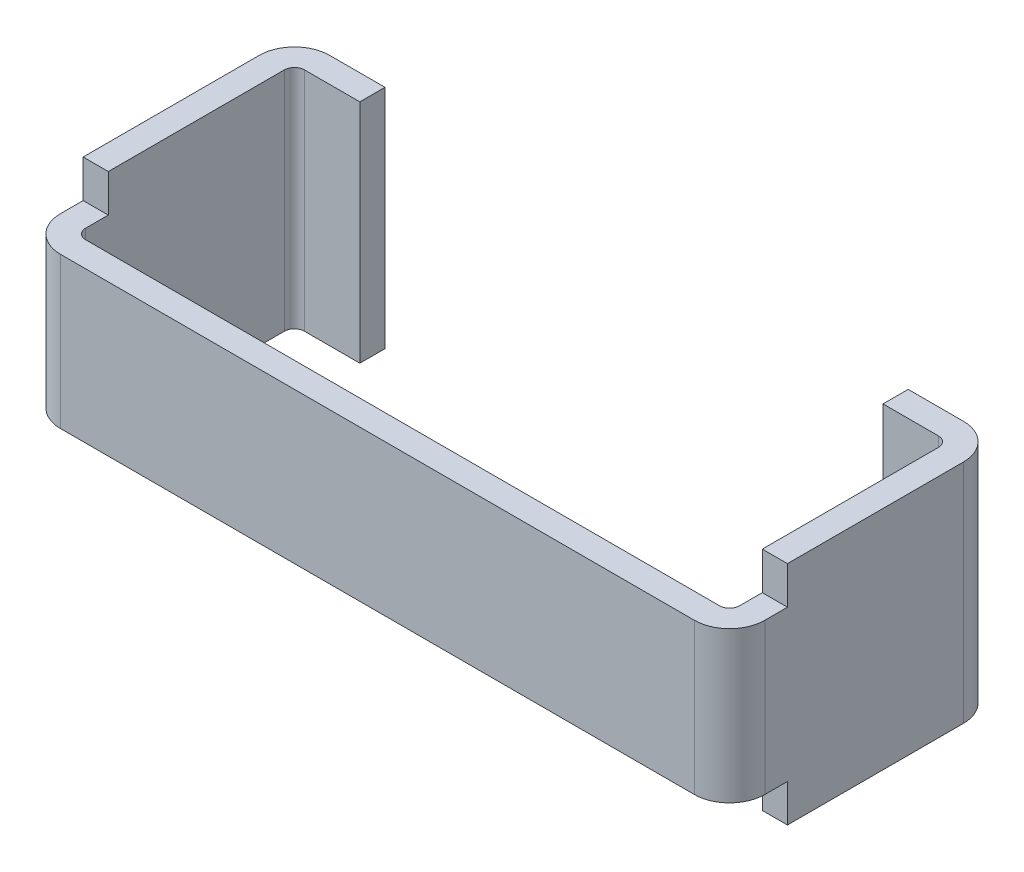
ISO-10303-21;
HEADER;
FILE_DESCRIPTION(('STEP AP214'),'2;1');
FILE_NAME('part.step','',(''),(''),'','','');
FILE_SCHEMA(('AUTOMOTIVE_DESIGN { 1 0 10303 214 1 1 1 1 }'));
ENDSEC;
DATA;
#1=APPLICATION_CONTEXT('core data for automotive mechanical design processes');
#2=APPLICATION_PROTOCOL_DEFINITION('international standard','automotive_design',2000,#1);
#3=PRODUCT_CONTEXT('',#1,'mechanical');
#4=PRODUCT('Part','Part','',(#3));
#5=PRODUCT_RELATED_PRODUCT_CATEGORY('part','',(#4));
#6=PRODUCT_DEFINITION_FORMATION('','',#4);
#7=PRODUCT_DEFINITION_CONTEXT('part definition',#1,'design');
#8=PRODUCT_DEFINITION('design','',#6,#7);
#9=PRODUCT_DEFINITION_SHAPE('','',#8);
#10=(LENGTH_UNIT() NAMED_UNIT(*) SI_UNIT(.MILLI.,.METRE.));
#11=(NAMED_UNIT(*) PLANE_ANGLE_UNIT() SI_UNIT($,.RADIAN.));
#12=(NAMED_UNIT(*) SI_UNIT($,.STERADIAN.) SOLID_ANGLE_UNIT());
#13=UNCERTAINTY_MEASURE_WITH_UNIT(LENGTH_MEASURE(1.E-05),#10,'distance_accuracy_value','');
#14=(GEOMETRIC_REPRESENTATION_CONTEXT(3) GLOBAL_UNCERTAINTY_ASSIGNED_CONTEXT((#13)) GLOBAL_UNIT_ASSIGNED_CONTEXT((#10,
#11,#12)) REPRESENTATION_CONTEXT('',''));
#15=CARTESIAN_POINT('',(0.,0.,0.));
#16=DIRECTION('',(0.,0.,1.));
#17=DIRECTION('',(1.,0.,0.));
#18=AXIS2_PLACEMENT_3D('',#15,#16,#17);
#19=CARTESIAN_POINT('',(6.3,-1.5,-4.65));
#20=DIRECTION('',(0.,-1.,0.));
#21=DIRECTION('',(0.,0.,-1.));
#22=AXIS2_PLACEMENT_3D('',#19,#20,#21);
#23=PLANE('',#22);
#24=DIRECTION('',(-1.,0.,0.));
#25=VECTOR('',#24,1.);
#26=CARTESIAN_POINT('',(6.3,-1.5,-1.15));
#27=LINE('',#26,#25);
#28=CARTESIAN_POINT('',(-6.5,-1.5,-1.15));
#29=VERTEX_POINT('',#28);
#30=CARTESIAN_POINT('',(-7.,-1.5,-1.15));
#31=VERTEX_POINT('',#30);
#32=EDGE_CURVE('E11',#29,#31,#27,.T.);
#33=ORIENTED_EDGE('',*,*,#32,.F.);
#34=DIRECTION('',(0.,0.,-1.));
#35=VECTOR('',#34,1.);
#36=CARTESIAN_POINT('',(-6.5,-1.5,-0.7));
#37=LINE('',#36,#35);
#38=CARTESIAN_POINT('',(-6.5,-1.5,-0.7));
#39=VERTEX_POINT('',#38);
#40=EDGE_CURVE('E24',#39,#29,#37,.T.);
#41=ORIENTED_EDGE('',*,*,#40,.F.);
#42=CARTESIAN_POINT('',(-6.3,-1.5,-0.7));
#43=DIRECTION('',(0.,-1.,0.));
#44=DIRECTION('',(1.,0.,0.));
#45=AXIS2_PLACEMENT_3D('',#42,#43,#44);
#46=CIRCLE('',#45,0.2);
#47=CARTESIAN_POINT('',(-6.3,-1.5,-0.5));
#48=VERTEX_POINT('',#47);
#49=EDGE_CURVE('E425',#48,#39,#46,.T.);
#50=ORIENTED_EDGE('',*,*,#49,.F.);
#51=DIRECTION('',(-1.,0.,0.));
#52=VECTOR('',#51,1.);
#53=CARTESIAN_POINT('',(6.3,-1.5,-0.5));
#54=LINE('',#53,#52);
#55=CARTESIAN_POINT('',(6.3,-1.5,-0.5));
#56=VERTEX_POINT('',#55);
#57=EDGE_CURVE('E422',#56,#48,#54,.T.);
#58=ORIENTED_EDGE('',*,*,#57,.F.);
#59=CARTESIAN_POINT('',(6.3,-1.5,-0.7));
#60=DIRECTION('',(0.,-1.,0.));
#61=DIRECTION('',(1.,0.,0.));
#62=AXIS2_PLACEMENT_3D('',#59,#60,#61);
#63=CIRCLE('',#62,0.2);
#64=CARTESIAN_POINT('',(6.5,-1.5,-0.7));
#65=VERTEX_POINT('',#64);
#66=EDGE_CURVE('E419',#65,#56,#63,.T.);
#67=ORIENTED_EDGE('',*,*,#66,.F.);
#68=DIRECTION('',(0.,0.,1.));
#69=VECTOR('',#68,1.);
#70=CARTESIAN_POINT('',(6.5,-1.5,-4.65));
#71=LINE('',#70,#69);
#72=CARTESIAN_POINT('',(6.5,-1.5,-1.15));
#73=VERTEX_POINT('',#72);
#74=EDGE_CURVE('E416',#73,#65,#71,.T.);
#75=ORIENTED_EDGE('',*,*,#74,.F.);
#76=DIRECTION('',(1.,0.,0.));
#77=VECTOR('',#76,1.);
#78=CARTESIAN_POINT('',(6.3,-1.5,-1.15));
#79=LINE('',#78,#77);
#80=CARTESIAN_POINT('',(7.,-1.5,-1.15));
#81=VERTEX_POINT('',#80);
#82=EDGE_CURVE('E414',#73,#81,#79,.T.);
#83=ORIENTED_EDGE('',*,*,#82,.T.);
#84=DIRECTION('',(0.,0.,-1.));
#85=VECTOR('',#84,1.);
#86=CARTESIAN_POINT('',(7.,-1.5,-4.65));
#87=LINE('',#86,#85);
#88=CARTESIAN_POINT('',(7.,-1.5,-0.7));
#89=VERTEX_POINT('',#88);
#90=EDGE_CURVE('E411',#89,#81,#87,.T.);
#91=ORIENTED_EDGE('',*,*,#90,.F.);
#92=CARTESIAN_POINT('',(6.3,-1.5,-0.7));
#93=DIRECTION('',(0.,1.,0.));
#94=DIRECTION('',(-1.,0.,0.));
#95=AXIS2_PLACEMENT_3D('',#92,#93,#94);
#96=CIRCLE('',#95,0.7);
#97=CARTESIAN_POINT('',(6.3,-1.5,0.));
#98=VERTEX_POINT('',#97);
#99=EDGE_CURVE('E408',#98,#89,#96,.T.);
#100=ORIENTED_EDGE('',*,*,#99,.F.);
#101=DIRECTION('',(1.,0.,0.));
#102=VECTOR('',#101,1.);
#103=CARTESIAN_POINT('',(6.3,-1.5,0.));
#104=LINE('',#103,#102);
#105=CARTESIAN_POINT('',(-6.3,-1.5,0.));
#106=VERTEX_POINT('',#105);
#107=EDGE_CURVE('E405',#106,#98,#104,.T.);
#108=ORIENTED_EDGE('',*,*,#107,.F.);
#109=CARTESIAN_POINT('',(-6.3,-1.5,-0.7));
#110=DIRECTION('',(0.,1.,0.));
#111=DIRECTION('',(1.,0.,0.));
#112=AXIS2_PLACEMENT_3D('',#109,#110,#111);
#113=CIRCLE('',#112,0.7);
#114=CARTESIAN_POINT('',(-7.,-1.5,-0.7));
#115=VERTEX_POINT('',#114);
#116=EDGE_CURVE('E402',#115,#106,#113,.T.);
#117=ORIENTED_EDGE('',*,*,#116,.F.);
#118=DIRECTION('',(0.,0.,1.));
#119=VECTOR('',#118,1.);
#120=CARTESIAN_POINT('',(-7.,-1.5,-0.7));
#121=LINE('',#120,#119);
#122=EDGE_CURVE('E399',#31,#115,#121,.T.);
#123=ORIENTED_EDGE('',*,*,#122,.F.);
#124=EDGE_LOOP('',(#33,#41,#50,#58,#67,#75,#83,#91,#100,#108,#117,#123));
#125=FACE_BOUND('',#124,.T.);
#126=ADVANCED_FACE('F17',(#125),#23,.T.);
#127=CARTESIAN_POINT('',(5.2,-1.5,-4.85));
#128=DIRECTION('',(-1.,0.,0.));
#129=DIRECTION('',(0.,0.,1.));
#130=AXIS2_PLACEMENT_3D('',#127,#128,#129);
#131=PLANE('',#130);
#132=DIRECTION('',(0.,1.,0.));
#133=VECTOR('',#132,1.);
#134=CARTESIAN_POINT('',(5.2,-1.5,-4.85));
#135=LINE('',#134,#133);
#136=CARTESIAN_POINT('',(5.2,-2.25,-4.85));
#137=VERTEX_POINT('',#136);
#138=CARTESIAN_POINT('',(5.2,2.25,-4.85));
#139=VERTEX_POINT('',#138);
#140=EDGE_CURVE('E397',#137,#139,#135,.T.);
#141=ORIENTED_EDGE('',*,*,#140,.T.);
#142=DIRECTION('',(0.,0.,-1.));
#143=VECTOR('',#142,1.);
#144=CARTESIAN_POINT('',(5.2,2.25,-4.85));
#145=LINE('',#144,#143);
#146=CARTESIAN_POINT('',(5.2,2.25,-5.35));
#147=VERTEX_POINT('',#146);
#148=EDGE_CURVE('E395',#139,#147,#145,.T.);
#149=ORIENTED_EDGE('',*,*,#148,.T.);
#150=DIRECTION('',(0.,1.,0.));
#151=VECTOR('',#150,1.);
#152=CARTESIAN_POINT('',(5.2,-1.5,-5.35));
#153=LINE('',#152,#151);
#154=CARTESIAN_POINT('',(5.2,-2.25,-5.35));
#155=VERTEX_POINT('',#154);
#156=EDGE_CURVE('E392',#155,#147,#153,.T.);
#157=ORIENTED_EDGE('',*,*,#156,.F.);
#158=DIRECTION('',(0.,0.,-1.));
#159=VECTOR('',#158,1.);
#160=CARTESIAN_POINT('',(5.2,-2.25,-4.85));
#161=LINE('',#160,#159);
#162=EDGE_CURVE('E389',#137,#155,#161,.T.);
#163=ORIENTED_EDGE('',*,*,#162,.F.);
#164=EDGE_LOOP('',(#141,#149,#157,#163));
#165=FACE_BOUND('',#164,.T.);
#166=ADVANCED_FACE('F517',(#165),#131,.T.);
#167=CARTESIAN_POINT('',(-6.3,-1.5,-5.35));
#168=DIRECTION('',(0.,0.,-1.));
#169=DIRECTION('',(-1.,0.,0.));
#170=AXIS2_PLACEMENT_3D('',#167,#168,#169);
#171=PLANE('',#170);
#172=DIRECTION('',(0.,1.,0.));
#173=VECTOR('',#172,1.);
#174=CARTESIAN_POINT('',(-6.3,-1.5,-5.35));
#175=LINE('',#174,#173);
#176=CARTESIAN_POINT('',(-6.3,-2.25,-5.35));
#177=VERTEX_POINT('',#176);
#178=CARTESIAN_POINT('',(-6.3,2.25,-5.35));
#179=VERTEX_POINT('',#178);
#180=EDGE_CURVE('E387',#177,#179,#175,.T.);
#181=ORIENTED_EDGE('',*,*,#180,.T.);
#182=DIRECTION('',(-1.,0.,0.));
#183=VECTOR('',#182,1.);
#184=CARTESIAN_POINT('',(-5.2,2.25,-5.35));
#185=LINE('',#184,#183);
#186=CARTESIAN_POINT('',(-5.2,2.25,-5.35));
#187=VERTEX_POINT('',#186);
#188=EDGE_CURVE('E384',#187,#179,#185,.T.);
#189=ORIENTED_EDGE('',*,*,#188,.F.);
#190=DIRECTION('',(0.,1.,0.));
#191=VECTOR('',#190,1.);
#192=CARTESIAN_POINT('',(-5.2,-1.5,-5.35));
#193=LINE('',#192,#191);
#194=CARTESIAN_POINT('',(-5.2,-2.25,-5.35));
#195=VERTEX_POINT('',#194);
#196=EDGE_CURVE('E381',#195,#187,#193,.T.);
#197=ORIENTED_EDGE('',*,*,#196,.F.);
#198=DIRECTION('',(-1.,0.,0.));
#199=VECTOR('',#198,1.);
#200=CARTESIAN_POINT('',(-5.2,-2.25,-5.35));
#201=LINE('',#200,#199);
#202=EDGE_CURVE('E378',#195,#177,#201,.T.);
#203=ORIENTED_EDGE('',*,*,#202,.T.);
#204=EDGE_LOOP('',(#181,#189,#197,#203));
#205=FACE_BOUND('',#204,.T.);
#206=ADVANCED_FACE('F535',(#205),#171,.T.);
#207=CARTESIAN_POINT('',(-6.3,-2.25,-4.65));
#208=DIRECTION('',(0.,1.,0.));
#209=DIRECTION('',(0.,0.,1.));
#210=AXIS2_PLACEMENT_3D('',#207,#208,#209);
#211=PLANE('',#210);
#212=DIRECTION('',(0.,0.,-1.));
#213=VECTOR('',#212,1.);
#214=CARTESIAN_POINT('',(-5.2,-2.25,-4.85));
#215=LINE('',#214,#213);
#216=CARTESIAN_POINT('',(-5.2,-2.25,-4.85));
#217=VERTEX_POINT('',#216);
#218=EDGE_CURVE('E375',#217,#195,#215,.T.);
#219=ORIENTED_EDGE('',*,*,#218,.F.);
#220=DIRECTION('',(1.,0.,0.));
#221=VECTOR('',#220,1.);
#222=CARTESIAN_POINT('',(-5.2,-2.25,-4.85));
#223=LINE('',#222,#221);
#224=CARTESIAN_POINT('',(-6.3,-2.25,-4.85));
#225=VERTEX_POINT('',#224);
#226=EDGE_CURVE('E373',#225,#217,#223,.T.);
#227=ORIENTED_EDGE('',*,*,#226,.F.);
#228=CARTESIAN_POINT('',(-6.3,-2.25,-4.65));
#229=DIRECTION('',(0.,-1.,0.));
#230=DIRECTION('',(1.,0.,0.));
#231=AXIS2_PLACEMENT_3D('',#228,#229,#230);
#232=CIRCLE('',#231,0.2);
#233=CARTESIAN_POINT('',(-6.5,-2.25,-4.65));
#234=VERTEX_POINT('',#233);
#235=EDGE_CURVE('E216',#234,#225,#232,.T.);
#236=ORIENTED_EDGE('',*,*,#235,.F.);
#237=DIRECTION('',(0.,0.,-1.));
#238=VECTOR('',#237,1.);
#239=CARTESIAN_POINT('',(-6.5,-2.25,-4.65));
#240=LINE('',#239,#238);
#241=CARTESIAN_POINT('',(-6.5,-2.25,-1.15));
#242=VERTEX_POINT('',#241);
#243=EDGE_CURVE('E370',#242,#234,#240,.T.);
#244=ORIENTED_EDGE('',*,*,#243,.F.);
#245=DIRECTION('',(1.,0.,0.));
#246=VECTOR('',#245,1.);
#247=CARTESIAN_POINT('',(-6.5,-2.25,-1.15));
#248=LINE('',#247,#246);
#249=CARTESIAN_POINT('',(-7.,-2.25,-1.15));
#250=VERTEX_POINT('',#249);
#251=EDGE_CURVE('E368',#250,#242,#248,.T.);
#252=ORIENTED_EDGE('',*,*,#251,.F.);
#253=DIRECTION('',(0.,0.,1.));
#254=VECTOR('',#253,1.);
#255=CARTESIAN_POINT('',(-7.,-2.25,-4.65));
#256=LINE('',#255,#254);
#257=CARTESIAN_POINT('',(-7.,-2.25,-4.65));
#258=VERTEX_POINT('',#257);
#259=EDGE_CURVE('E366',#258,#250,#256,.T.);
#260=ORIENTED_EDGE('',*,*,#259,.F.);
#261=CARTESIAN_POINT('',(-6.3,-2.25,-4.65));
#262=DIRECTION('',(0.,1.,0.));
#263=DIRECTION('',(1.,0.,0.));
#264=AXIS2_PLACEMENT_3D('',#261,#262,#263);
#265=CIRCLE('',#264,0.7);
#266=EDGE_CURVE('E364',#177,#258,#265,.T.);
#267=ORIENTED_EDGE('',*,*,#266,.F.);
#268=ORIENTED_EDGE('',*,*,#202,.F.);
#269=EDGE_LOOP('',(#219,#227,#236,#244,#252,#260,#267,#268));
#270=FACE_BOUND('',#269,.T.);
#271=ADVANCED_FACE('F438',(#270),#211,.F.);
#272=CARTESIAN_POINT('',(-5.2,-1.5,-4.85));
#273=DIRECTION('',(1.,0.,0.));
#274=DIRECTION('',(0.,0.,-1.));
#275=AXIS2_PLACEMENT_3D('',#272,#273,#274);
#276=PLANE('',#275);
#277=ORIENTED_EDGE('',*,*,#196,.T.);
#278=DIRECTION('',(0.,0.,-1.));
#279=VECTOR('',#278,1.);
#280=CARTESIAN_POINT('',(-5.2,2.25,-4.85));
#281=LINE('',#280,#279);
#282=CARTESIAN_POINT('',(-5.2,2.25,-4.85));
#283=VERTEX_POINT('',#282);
#284=EDGE_CURVE('E362',#283,#187,#281,.T.);
#285=ORIENTED_EDGE('',*,*,#284,.F.);
#286=DIRECTION('',(0.,1.,0.));
#287=VECTOR('',#286,1.);
#288=CARTESIAN_POINT('',(-5.2,-1.5,-4.85));
#289=LINE('',#288,#287);
#290=EDGE_CURVE('E204',#217,#283,#289,.T.);
#291=ORIENTED_EDGE('',*,*,#290,.F.);
#292=ORIENTED_EDGE('',*,*,#218,.T.);
#293=EDGE_LOOP('',(#277,#285,#291,#292));
#294=FACE_BOUND('',#293,.T.);
#295=ADVANCED_FACE('F521',(#294),#276,.T.);
#296=CARTESIAN_POINT('',(5.2,-1.5,-4.85));
#297=DIRECTION('',(0.,0.,1.));
#298=DIRECTION('',(1.,0.,0.));
#299=AXIS2_PLACEMENT_3D('',#296,#297,#298);
#300=PLANE('',#299);
#301=DIRECTION('',(0.,1.,0.));
#302=VECTOR('',#301,1.);
#303=CARTESIAN_POINT('',(6.3,-1.5,-4.85));
#304=LINE('',#303,#302);
#305=CARTESIAN_POINT('',(6.3,-2.25,-4.85));
#306=VERTEX_POINT('',#305);
#307=CARTESIAN_POINT('',(6.3,2.25,-4.85));
#308=VERTEX_POINT('',#307);
#309=EDGE_CURVE('E359',#306,#308,#304,.T.);
#310=ORIENTED_EDGE('',*,*,#309,.T.);
#311=DIRECTION('',(-1.,0.,0.));
#312=VECTOR('',#311,1.);
#313=CARTESIAN_POINT('',(5.2,2.25,-4.85));
#314=LINE('',#313,#312);
#315=EDGE_CURVE('E356',#308,#139,#314,.T.);
#316=ORIENTED_EDGE('',*,*,#315,.T.);
#317=ORIENTED_EDGE('',*,*,#140,.F.);
#318=DIRECTION('',(-1.,0.,0.));
#319=VECTOR('',#318,1.);
#320=CARTESIAN_POINT('',(5.2,-2.25,-4.85));
#321=LINE('',#320,#319);
#322=EDGE_CURVE('E353',#306,#137,#321,.T.);
#323=ORIENTED_EDGE('',*,*,#322,.F.);
#324=EDGE_LOOP('',(#310,#316,#317,#323));
#325=FACE_BOUND('',#324,.T.);
#326=ADVANCED_FACE('F519',(#325),#300,.T.);
#327=CARTESIAN_POINT('',(6.3,2.25,-4.65));
#328=DIRECTION('',(0.,-1.,0.));
#329=DIRECTION('',(0.,0.,-1.));
#330=AXIS2_PLACEMENT_3D('',#327,#328,#329);
#331=PLANE('',#330);
#332=ORIENTED_EDGE('',*,*,#148,.F.);
#333=ORIENTED_EDGE('',*,*,#315,.F.);
#334=CARTESIAN_POINT('',(6.3,2.25,-4.65));
#335=DIRECTION('',(0.,1.,0.));
#336=DIRECTION('',(-1.,0.,0.));
#337=AXIS2_PLACEMENT_3D('',#334,#335,#336);
#338=CIRCLE('',#337,0.2);
#339=CARTESIAN_POINT('',(6.5,2.25,-4.65));
#340=VERTEX_POINT('',#339);
#341=EDGE_CURVE('E350',#340,#308,#338,.T.);
#342=ORIENTED_EDGE('',*,*,#341,.F.);
#343=DIRECTION('',(0.,0.,-1.));
#344=VECTOR('',#343,1.);
#345=CARTESIAN_POINT('',(6.5,2.25,-4.65));
#346=LINE('',#345,#344);
#347=CARTESIAN_POINT('',(6.5,2.25,-1.15));
#348=VERTEX_POINT('',#347);
#349=EDGE_CURVE('E348',#348,#340,#346,.T.);
#350=ORIENTED_EDGE('',*,*,#349,.F.);
#351=DIRECTION('',(-1.,0.,0.));
#352=VECTOR('',#351,1.);
#353=CARTESIAN_POINT('',(6.5,2.25,-1.15));
#354=LINE('',#353,#352);
#355=CARTESIAN_POINT('',(7.,2.25,-1.15));
#356=VERTEX_POINT('',#355);
#357=EDGE_CURVE('E346',#356,#348,#354,.T.);
#358=ORIENTED_EDGE('',*,*,#357,.F.);
#359=DIRECTION('',(0.,0.,1.));
#360=VECTOR('',#359,1.);
#361=CARTESIAN_POINT('',(7.,2.25,-4.65));
#362=LINE('',#361,#360);
#363=CARTESIAN_POINT('',(7.,2.25,-4.65));
#364=VERTEX_POINT('',#363);
#365=EDGE_CURVE('E344',#364,#356,#362,.T.);
#366=ORIENTED_EDGE('',*,*,#365,.F.);
#367=CARTESIAN_POINT('',(6.3,2.25,-4.65));
#368=DIRECTION('',(0.,-1.,0.));
#369=DIRECTION('',(-1.,0.,0.));
#370=AXIS2_PLACEMENT_3D('',#367,#368,#369);
#371=CIRCLE('',#370,0.7);
#372=CARTESIAN_POINT('',(6.3,2.25,-5.35));
#373=VERTEX_POINT('',#372);
#374=EDGE_CURVE('E342',#373,#364,#371,.T.);
#375=ORIENTED_EDGE('',*,*,#374,.F.);
#376=DIRECTION('',(1.,0.,0.));
#377=VECTOR('',#376,1.);
#378=CARTESIAN_POINT('',(5.2,2.25,-5.35));
#379=LINE('',#378,#377);
#380=EDGE_CURVE('E340',#147,#373,#379,.T.);
#381=ORIENTED_EDGE('',*,*,#380,.F.);
#382=EDGE_LOOP('',(#332,#333,#342,#350,#358,#366,#375,#381));
#383=FACE_BOUND('',#382,.T.);
#384=ADVANCED_FACE('F481',(#383),#331,.F.);
#385=CARTESIAN_POINT('',(5.2,-1.5,-5.35));
#386=DIRECTION('',(0.,0.,-1.));
#387=DIRECTION('',(-1.,0.,0.));
#388=AXIS2_PLACEMENT_3D('',#385,#386,#387);
#389=PLANE('',#388);
#390=ORIENTED_EDGE('',*,*,#156,.T.);
#391=ORIENTED_EDGE('',*,*,#380,.T.);
#392=DIRECTION('',(0.,1.,0.));
#393=VECTOR('',#392,1.);
#394=CARTESIAN_POINT('',(6.3,-1.5,-5.35));
#395=LINE('',#394,#393);
#396=CARTESIAN_POINT('',(6.3,-2.25,-5.35));
#397=VERTEX_POINT('',#396);
#398=EDGE_CURVE('E337',#397,#373,#395,.T.);
#399=ORIENTED_EDGE('',*,*,#398,.F.);
#400=DIRECTION('',(1.,0.,0.));
#401=VECTOR('',#400,1.);
#402=CARTESIAN_POINT('',(5.2,-2.25,-5.35));
#403=LINE('',#402,#401);
#404=EDGE_CURVE('E334',#155,#397,#403,.T.);
#405=ORIENTED_EDGE('',*,*,#404,.F.);
#406=EDGE_LOOP('',(#390,#391,#399,#405));
#407=FACE_BOUND('',#406,.T.);
#408=ADVANCED_FACE('F514',(#407),#389,.T.);
#409=CARTESIAN_POINT('',(6.3,-2.25,-4.65));
#410=DIRECTION('',(0.,-1.,0.));
#411=DIRECTION('',(0.,0.,-1.));
#412=AXIS2_PLACEMENT_3D('',#409,#410,#411);
#413=PLANE('',#412);
#414=ORIENTED_EDGE('',*,*,#162,.T.);
#415=ORIENTED_EDGE('',*,*,#404,.T.);
#416=CARTESIAN_POINT('',(6.3,-2.25,-4.65));
#417=DIRECTION('',(0.,-1.,0.));
#418=DIRECTION('',(-1.,0.,0.));
#419=AXIS2_PLACEMENT_3D('',#416,#417,#418);
#420=CIRCLE('',#419,0.7);
#421=CARTESIAN_POINT('',(7.,-2.25,-4.65));
#422=VERTEX_POINT('',#421);
#423=EDGE_CURVE('E332',#397,#422,#420,.T.);
#424=ORIENTED_EDGE('',*,*,#423,.T.);
#425=DIRECTION('',(0.,0.,1.));
#426=VECTOR('',#425,1.);
#427=CARTESIAN_POINT('',(7.,-2.25,-4.65));
#428=LINE('',#427,#426);
#429=CARTESIAN_POINT('',(7.,-2.25,-1.15));
#430=VERTEX_POINT('',#429);
#431=EDGE_CURVE('E330',#422,#430,#428,.T.);
#432=ORIENTED_EDGE('',*,*,#431,.T.);
#433=DIRECTION('',(-1.,0.,0.));
#434=VECTOR('',#433,1.);
#435=CARTESIAN_POINT('',(6.5,-2.25,-1.15));
#436=LINE('',#435,#434);
#437=CARTESIAN_POINT('',(6.5,-2.25,-1.15));
#438=VERTEX_POINT('',#437);
#439=EDGE_CURVE('E328',#430,#438,#436,.T.);
#440=ORIENTED_EDGE('',*,*,#439,.T.);
#441=DIRECTION('',(0.,0.,-1.));
#442=VECTOR('',#441,1.);
#443=CARTESIAN_POINT('',(6.5,-2.25,-4.65));
#444=LINE('',#443,#442);
#445=CARTESIAN_POINT('',(6.5,-2.25,-4.65));
#446=VERTEX_POINT('',#445);
#447=EDGE_CURVE('E326',#438,#446,#444,.T.);
#448=ORIENTED_EDGE('',*,*,#447,.T.);
#449=CARTESIAN_POINT('',(6.3,-2.25,-4.65));
#450=DIRECTION('',(0.,1.,0.));
#451=DIRECTION('',(-1.,0.,0.));
#452=AXIS2_PLACEMENT_3D('',#449,#450,#451);
#453=CIRCLE('',#452,0.2);
#454=EDGE_CURVE('E323',#446,#306,#453,.T.);
#455=ORIENTED_EDGE('',*,*,#454,.T.);
#456=ORIENTED_EDGE('',*,*,#322,.T.);
#457=EDGE_LOOP('',(#414,#415,#424,#432,#440,#448,#455,#456));
#458=FACE_BOUND('',#457,.T.);
#459=ADVANCED_FACE('F491',(#458),#413,.T.);
#460=CARTESIAN_POINT('',(6.3,-1.5,-4.65));
#461=DIRECTION('',(0.,-1.,0.));
#462=DIRECTION('',(0.,0.,1.));
#463=AXIS2_PLACEMENT_3D('',#460,#461,#462);
#464=CYLINDRICAL_SURFACE('',#463,0.2);
#465=DIRECTION('',(0.,1.,0.));
#466=VECTOR('',#465,1.);
#467=CARTESIAN_POINT('',(6.5,-1.5,-4.65));
#468=LINE('',#467,#466);
#469=EDGE_CURVE('E320',#446,#340,#468,.T.);
#470=ORIENTED_EDGE('',*,*,#469,.T.);
#471=ORIENTED_EDGE('',*,*,#341,.T.);
#472=ORIENTED_EDGE('',*,*,#309,.F.);
#473=ORIENTED_EDGE('',*,*,#454,.F.);
#474=EDGE_LOOP('',(#470,#471,#472,#473));
#475=FACE_BOUND('',#474,.T.);
#476=ADVANCED_FACE('F488',(#475),#464,.F.);
#477=CARTESIAN_POINT('',(6.5,-1.5,-4.65));
#478=DIRECTION('',(-1.,0.,0.));
#479=DIRECTION('',(0.,0.,1.));
#480=AXIS2_PLACEMENT_3D('',#477,#478,#479);
#481=PLANE('',#480);
#482=DIRECTION('',(0.,1.,0.));
#483=VECTOR('',#482,1.);
#484=CARTESIAN_POINT('',(6.5,-2.25,-1.15));
#485=LINE('',#484,#483);
#486=EDGE_CURVE('E317',#438,#73,#485,.T.);
#487=ORIENTED_EDGE('',*,*,#486,.T.);
#488=ORIENTED_EDGE('',*,*,#74,.T.);
#489=DIRECTION('',(0.,1.,0.));
#490=VECTOR('',#489,1.);
#491=CARTESIAN_POINT('',(6.5,-1.5,-0.7));
#492=LINE('',#491,#490);
#493=CARTESIAN_POINT('',(6.5,1.5,-0.7));
#494=VERTEX_POINT('',#493);
#495=EDGE_CURVE('E315',#65,#494,#492,.T.);
#496=ORIENTED_EDGE('',*,*,#495,.T.);
#497=DIRECTION('',(0.,0.,1.));
#498=VECTOR('',#497,1.);
#499=CARTESIAN_POINT('',(6.5,1.5,-4.65));
#500=LINE('',#499,#498);
#501=CARTESIAN_POINT('',(6.5,1.5,-1.15));
#502=VERTEX_POINT('',#501);
#503=EDGE_CURVE('E312',#502,#494,#500,.T.);
#504=ORIENTED_EDGE('',*,*,#503,.F.);
#505=DIRECTION('',(0.,1.,0.));
#506=VECTOR('',#505,1.);
#507=CARTESIAN_POINT('',(6.5,-2.25,-1.15));
#508=LINE('',#507,#506);
#509=EDGE_CURVE('E309',#502,#348,#508,.T.);
#510=ORIENTED_EDGE('',*,*,#509,.T.);
#511=ORIENTED_EDGE('',*,*,#349,.T.);
#512=ORIENTED_EDGE('',*,*,#469,.F.);
#513=ORIENTED_EDGE('',*,*,#447,.F.);
#514=EDGE_LOOP('',(#487,#488,#496,#504,#510,#511,#512,#513));
#515=FACE_BOUND('',#514,.T.);
#516=ADVANCED_FACE('F472',(#515),#481,.T.);
#517=CARTESIAN_POINT('',(6.5,-2.25,-1.15));
#518=DIRECTION('',(0.,0.,-1.));
#519=DIRECTION('',(-1.,0.,0.));
#520=AXIS2_PLACEMENT_3D('',#517,#518,#519);
#521=PLANE('',#520);
#522=ORIENTED_EDGE('',*,*,#509,.F.);
#523=DIRECTION('',(1.,0.,0.));
#524=VECTOR('',#523,1.);
#525=CARTESIAN_POINT('',(6.3,1.5,-1.15));
#526=LINE('',#525,#524);
#527=CARTESIAN_POINT('',(7.,1.5,-1.15));
#528=VERTEX_POINT('',#527);
#529=EDGE_CURVE('E306',#502,#528,#526,.T.);
#530=ORIENTED_EDGE('',*,*,#529,.T.);
#531=DIRECTION('',(0.,1.,0.));
#532=VECTOR('',#531,1.);
#533=CARTESIAN_POINT('',(7.,-2.25,-1.15));
#534=LINE('',#533,#532);
#535=EDGE_CURVE('E303',#528,#356,#534,.T.);
#536=ORIENTED_EDGE('',*,*,#535,.T.);
#537=ORIENTED_EDGE('',*,*,#357,.T.);
#538=EDGE_LOOP('',(#522,#530,#536,#537));
#539=FACE_BOUND('',#538,.T.);
#540=ADVANCED_FACE('F474',(#539),#521,.F.);
#541=CARTESIAN_POINT('',(7.,-1.5,-4.65));
#542=DIRECTION('',(1.,0.,0.));
#543=DIRECTION('',(0.,0.,-1.));
#544=AXIS2_PLACEMENT_3D('',#541,#542,#543);
#545=PLANE('',#544);
#546=ORIENTED_EDGE('',*,*,#535,.F.);
#547=DIRECTION('',(0.,0.,-1.));
#548=VECTOR('',#547,1.);
#549=CARTESIAN_POINT('',(7.,1.5,-4.65));
#550=LINE('',#549,#548);
#551=CARTESIAN_POINT('',(7.,1.5,-0.7));
#552=VERTEX_POINT('',#551);
#553=EDGE_CURVE('E300',#552,#528,#550,.T.);
#554=ORIENTED_EDGE('',*,*,#553,.F.);
#555=DIRECTION('',(0.,1.,0.));
#556=VECTOR('',#555,1.);
#557=CARTESIAN_POINT('',(7.,-1.5,-0.7));
#558=LINE('',#557,#556);
#559=EDGE_CURVE('E297',#89,#552,#558,.T.);
#560=ORIENTED_EDGE('',*,*,#559,.F.);
#561=ORIENTED_EDGE('',*,*,#90,.T.);
#562=DIRECTION('',(0.,1.,0.));
#563=VECTOR('',#562,1.);
#564=CARTESIAN_POINT('',(7.,-2.25,-1.15));
#565=LINE('',#564,#563);
#566=EDGE_CURVE('E294',#430,#81,#565,.T.);
#567=ORIENTED_EDGE('',*,*,#566,.F.);
#568=ORIENTED_EDGE('',*,*,#431,.F.);
#569=DIRECTION('',(0.,1.,0.));
#570=VECTOR('',#569,1.);
#571=CARTESIAN_POINT('',(7.,-1.5,-4.65));
#572=LINE('',#571,#570);
#573=EDGE_CURVE('E291',#422,#364,#572,.T.);
#574=ORIENTED_EDGE('',*,*,#573,.T.);
#575=ORIENTED_EDGE('',*,*,#365,.T.);
#576=EDGE_LOOP('',(#546,#554,#560,#561,#567,#568,#574,#575));
#577=FACE_BOUND('',#576,.T.);
#578=ADVANCED_FACE('F499',(#577),#545,.T.);
#579=CARTESIAN_POINT('',(6.3,-1.5,-4.65));
#580=DIRECTION('',(0.,-1.,0.));
#581=DIRECTION('',(0.,0.,1.));
#582=AXIS2_PLACEMENT_3D('',#579,#580,#581);
#583=CYLINDRICAL_SURFACE('',#582,0.7);
#584=ORIENTED_EDGE('',*,*,#398,.T.);
#585=ORIENTED_EDGE('',*,*,#374,.T.);
#586=ORIENTED_EDGE('',*,*,#573,.F.);
#587=ORIENTED_EDGE('',*,*,#423,.F.);
#588=EDGE_LOOP('',(#584,#585,#586,#587));
#589=FACE_BOUND('',#588,.T.);
#590=ADVANCED_FACE('F511',(#589),#583,.T.);
#591=CARTESIAN_POINT('',(6.5,-2.25,-1.15));
#592=DIRECTION('',(0.,0.,-1.));
#593=DIRECTION('',(-1.,0.,0.));
#594=AXIS2_PLACEMENT_3D('',#591,#592,#593);
#595=PLANE('',#594);
#596=ORIENTED_EDGE('',*,*,#82,.F.);
#597=ORIENTED_EDGE('',*,*,#486,.F.);
#598=ORIENTED_EDGE('',*,*,#439,.F.);
#599=ORIENTED_EDGE('',*,*,#566,.T.);
#600=EDGE_LOOP('',(#596,#597,#598,#599));
#601=FACE_BOUND('',#600,.T.);
#602=ADVANCED_FACE('F497',(#601),#595,.F.);
#603=CARTESIAN_POINT('',(6.3,-1.5,-0.7));
#604=DIRECTION('',(0.,-1.,0.));
#605=DIRECTION('',(0.,0.,1.));
#606=AXIS2_PLACEMENT_3D('',#603,#604,#605);
#607=CYLINDRICAL_SURFACE('',#606,0.2);
#608=CARTESIAN_POINT('',(6.3,1.5,-0.7));
#609=DIRECTION('',(0.,-1.,0.));
#610=DIRECTION('',(1.,0.,0.));
#611=AXIS2_PLACEMENT_3D('',#608,#609,#610);
#612=CIRCLE('',#611,0.2);
#613=CARTESIAN_POINT('',(6.3,1.5,-0.5));
#614=VERTEX_POINT('',#613);
#615=EDGE_CURVE('E288',#494,#614,#612,.T.);
#616=ORIENTED_EDGE('',*,*,#615,.F.);
#617=ORIENTED_EDGE('',*,*,#495,.F.);
#618=ORIENTED_EDGE('',*,*,#66,.T.);
#619=DIRECTION('',(0.,1.,0.));
#620=VECTOR('',#619,1.);
#621=CARTESIAN_POINT('',(6.3,-1.5,-0.5));
#622=LINE('',#621,#620);
#623=EDGE_CURVE('E286',#56,#614,#622,.T.);
#624=ORIENTED_EDGE('',*,*,#623,.T.);
#625=EDGE_LOOP('',(#616,#617,#618,#624));
#626=FACE_BOUND('',#625,.T.);
#627=ADVANCED_FACE('F467',(#626),#607,.F.);
#628=CARTESIAN_POINT('',(6.3,1.5,-4.65));
#629=DIRECTION('',(0.,-1.,0.));
#630=DIRECTION('',(0.,0.,-1.));
#631=AXIS2_PLACEMENT_3D('',#628,#629,#630);
#632=PLANE('',#631);
#633=DIRECTION('',(0.,0.,-1.));
#634=VECTOR('',#633,1.);
#635=CARTESIAN_POINT('',(-6.5,1.5,-0.7));
#636=LINE('',#635,#634);
#637=CARTESIAN_POINT('',(-6.5,1.5,-0.7));
#638=VERTEX_POINT('',#637);
#639=CARTESIAN_POINT('',(-6.5,1.5,-1.15));
#640=VERTEX_POINT('',#639);
#641=EDGE_CURVE('E283',#638,#640,#636,.T.);
#642=ORIENTED_EDGE('',*,*,#641,.T.);
#643=DIRECTION('',(-1.,0.,0.));
#644=VECTOR('',#643,1.);
#645=CARTESIAN_POINT('',(6.3,1.5,-1.15));
#646=LINE('',#645,#644);
#647=CARTESIAN_POINT('',(-7.,1.5,-1.15));
#648=VERTEX_POINT('',#647);
#649=EDGE_CURVE('E280',#640,#648,#646,.T.);
#650=ORIENTED_EDGE('',*,*,#649,.T.);
#651=DIRECTION('',(0.,0.,1.));
#652=VECTOR('',#651,1.);
#653=CARTESIAN_POINT('',(-7.,1.5,-0.7));
#654=LINE('',#653,#652);
#655=CARTESIAN_POINT('',(-7.,1.5,-0.7));
#656=VERTEX_POINT('',#655);
#657=EDGE_CURVE('E277',#648,#656,#654,.T.);
#658=ORIENTED_EDGE('',*,*,#657,.T.);
#659=CARTESIAN_POINT('',(-6.3,1.5,-0.7));
#660=DIRECTION('',(0.,1.,0.));
#661=DIRECTION('',(1.,0.,0.));
#662=AXIS2_PLACEMENT_3D('',#659,#660,#661);
#663=CIRCLE('',#662,0.7);
#664=CARTESIAN_POINT('',(-6.3,1.5,0.));
#665=VERTEX_POINT('',#664);
#666=EDGE_CURVE('E274',#656,#665,#663,.T.);
#667=ORIENTED_EDGE('',*,*,#666,.T.);
#668=DIRECTION('',(1.,0.,0.));
#669=VECTOR('',#668,1.);
#670=CARTESIAN_POINT('',(6.3,1.5,0.));
#671=LINE('',#670,#669);
#672=CARTESIAN_POINT('',(6.3,1.5,0.));
#673=VERTEX_POINT('',#672);
#674=EDGE_CURVE('E271',#665,#673,#671,.T.);
#675=ORIENTED_EDGE('',*,*,#674,.T.);
#676=CARTESIAN_POINT('',(6.3,1.5,-0.7));
#677=DIRECTION('',(0.,1.,0.));
#678=DIRECTION('',(-1.,0.,0.));
#679=AXIS2_PLACEMENT_3D('',#676,#677,#678);
#680=CIRCLE('',#679,0.7);
#681=EDGE_CURVE('E268',#673,#552,#680,.T.);
#682=ORIENTED_EDGE('',*,*,#681,.T.);
#683=ORIENTED_EDGE('',*,*,#553,.T.);
#684=ORIENTED_EDGE('',*,*,#529,.F.);
#685=ORIENTED_EDGE('',*,*,#503,.T.);
#686=ORIENTED_EDGE('',*,*,#615,.T.);
#687=DIRECTION('',(-1.,0.,0.));
#688=VECTOR('',#687,1.);
#689=CARTESIAN_POINT('',(6.3,1.5,-0.5));
#690=LINE('',#689,#688);
#691=CARTESIAN_POINT('',(-6.3,1.5,-0.5));
#692=VERTEX_POINT('',#691);
#693=EDGE_CURVE('E265',#614,#692,#690,.T.);
#694=ORIENTED_EDGE('',*,*,#693,.T.);
#695=CARTESIAN_POINT('',(-6.3,1.5,-0.7));
#696=DIRECTION('',(0.,-1.,0.));
#697=DIRECTION('',(1.,0.,0.));
#698=AXIS2_PLACEMENT_3D('',#695,#696,#697);
#699=CIRCLE('',#698,0.2);
#700=EDGE_CURVE('E263',#692,#638,#699,.T.);
#701=ORIENTED_EDGE('',*,*,#700,.T.);
#702=EDGE_LOOP('',(#642,#650,#658,#667,#675,#682,#683,#684,#685,#686,#694,#701));
#703=FACE_BOUND('',#702,.T.);
#704=ADVANCED_FACE('F457',(#703),#632,.F.);
#705=CARTESIAN_POINT('',(6.3,-1.5,-0.7));
#706=DIRECTION('',(0.,-1.,0.));
#707=DIRECTION('',(0.,0.,1.));
#708=AXIS2_PLACEMENT_3D('',#705,#706,#707);
#709=CYLINDRICAL_SURFACE('',#708,0.7);
#710=ORIENTED_EDGE('',*,*,#681,.F.);
#711=DIRECTION('',(0.,1.,0.));
#712=VECTOR('',#711,1.);
#713=CARTESIAN_POINT('',(6.3,-1.5,0.));
#714=LINE('',#713,#712);
#715=EDGE_CURVE('E260',#98,#673,#714,.T.);
#716=ORIENTED_EDGE('',*,*,#715,.F.);
#717=ORIENTED_EDGE('',*,*,#99,.T.);
#718=ORIENTED_EDGE('',*,*,#559,.T.);
#719=EDGE_LOOP('',(#710,#716,#717,#718));
#720=FACE_BOUND('',#719,.T.);
#721=ADVANCED_FACE('F504',(#720),#709,.T.);
#722=CARTESIAN_POINT('',(6.3,-1.5,0.));
#723=DIRECTION('',(0.,0.,1.));
#724=DIRECTION('',(1.,0.,0.));
#725=AXIS2_PLACEMENT_3D('',#722,#723,#724);
#726=PLANE('',#725);
#727=ORIENTED_EDGE('',*,*,#674,.F.);
#728=DIRECTION('',(0.,1.,0.));
#729=VECTOR('',#728,1.);
#730=CARTESIAN_POINT('',(-6.3,-1.5,0.));
#731=LINE('',#730,#729);
#732=EDGE_CURVE('E257',#106,#665,#731,.T.);
#733=ORIENTED_EDGE('',*,*,#732,.F.);
#734=ORIENTED_EDGE('',*,*,#107,.T.);
#735=ORIENTED_EDGE('',*,*,#715,.T.);
#736=EDGE_LOOP('',(#727,#733,#734,#735));
#737=FACE_BOUND('',#736,.T.);
#738=ADVANCED_FACE('F506',(#737),#726,.T.);
#739=CARTESIAN_POINT('',(-6.3,-1.5,-0.7));
#740=DIRECTION('',(0.,-1.,0.));
#741=DIRECTION('',(0.,0.,1.));
#742=AXIS2_PLACEMENT_3D('',#739,#740,#741);
#743=CYLINDRICAL_SURFACE('',#742,0.7);
#744=ORIENTED_EDGE('',*,*,#666,.F.);
#745=DIRECTION('',(0.,1.,0.));
#746=VECTOR('',#745,1.);
#747=CARTESIAN_POINT('',(-7.,-1.5,-0.7));
#748=LINE('',#747,#746);
#749=EDGE_CURVE('E254',#115,#656,#748,.T.);
#750=ORIENTED_EDGE('',*,*,#749,.F.);
#751=ORIENTED_EDGE('',*,*,#116,.T.);
#752=ORIENTED_EDGE('',*,*,#732,.T.);
#753=EDGE_LOOP('',(#744,#750,#751,#752));
#754=FACE_BOUND('',#753,.T.);
#755=ADVANCED_FACE('F454',(#754),#743,.T.);
#756=CARTESIAN_POINT('',(-7.,-1.5,-0.7));
#757=DIRECTION('',(-1.,0.,0.));
#758=DIRECTION('',(0.,0.,1.));
#759=AXIS2_PLACEMENT_3D('',#756,#757,#758);
#760=PLANE('',#759);
#761=ORIENTED_EDGE('',*,*,#657,.F.);
#762=DIRECTION('',(0.,1.,0.));
#763=VECTOR('',#762,1.);
#764=CARTESIAN_POINT('',(-7.,-2.25,-1.15));
#765=LINE('',#764,#763);
#766=CARTESIAN_POINT('',(-7.,2.25,-1.15));
#767=VERTEX_POINT('',#766);
#768=EDGE_CURVE('E252',#648,#767,#765,.T.);
#769=ORIENTED_EDGE('',*,*,#768,.T.);
#770=DIRECTION('',(0.,0.,1.));
#771=VECTOR('',#770,1.);
#772=CARTESIAN_POINT('',(-7.,2.25,-4.65));
#773=LINE('',#772,#771);
#774=CARTESIAN_POINT('',(-7.,2.25,-4.65));
#775=VERTEX_POINT('',#774);
#776=EDGE_CURVE('E249',#775,#767,#773,.T.);
#777=ORIENTED_EDGE('',*,*,#776,.F.);
#778=DIRECTION('',(0.,1.,0.));
#779=VECTOR('',#778,1.);
#780=CARTESIAN_POINT('',(-7.,-1.5,-4.65));
#781=LINE('',#780,#779);
#782=EDGE_CURVE('E246',#258,#775,#781,.T.);
#783=ORIENTED_EDGE('',*,*,#782,.F.);
#784=ORIENTED_EDGE('',*,*,#259,.T.);
#785=DIRECTION('',(0.,1.,0.));
#786=VECTOR('',#785,1.);
#787=CARTESIAN_POINT('',(-7.,-2.25,-1.15));
#788=LINE('',#787,#786);
#789=EDGE_CURVE('E243',#250,#31,#788,.T.);
#790=ORIENTED_EDGE('',*,*,#789,.T.);
#791=ORIENTED_EDGE('',*,*,#122,.T.);
#792=ORIENTED_EDGE('',*,*,#749,.T.);
#793=EDGE_LOOP('',(#761,#769,#777,#783,#784,#790,#791,#792));
#794=FACE_BOUND('',#793,.T.);
#795=ADVANCED_FACE('F447',(#794),#760,.T.);
#796=CARTESIAN_POINT('',(-6.5,-1.5,-0.7));
#797=DIRECTION('',(1.,0.,0.));
#798=DIRECTION('',(0.,0.,-1.));
#799=AXIS2_PLACEMENT_3D('',#796,#797,#798);
#800=PLANE('',#799);
#801=ORIENTED_EDGE('',*,*,#40,.T.);
#802=DIRECTION('',(0.,1.,0.));
#803=VECTOR('',#802,1.);
#804=CARTESIAN_POINT('',(-6.5,-2.25,-1.15));
#805=LINE('',#804,#803);
#806=EDGE_CURVE('E241',#242,#29,#805,.T.);
#807=ORIENTED_EDGE('',*,*,#806,.F.);
#808=ORIENTED_EDGE('',*,*,#243,.T.);
#809=DIRECTION('',(0.,1.,0.));
#810=VECTOR('',#809,1.);
#811=CARTESIAN_POINT('',(-6.5,-1.5,-4.65));
#812=LINE('',#811,#810);
#813=CARTESIAN_POINT('',(-6.5,2.25,-4.65));
#814=VERTEX_POINT('',#813);
#815=EDGE_CURVE('E239',#234,#814,#812,.T.);
#816=ORIENTED_EDGE('',*,*,#815,.T.);
#817=DIRECTION('',(0.,0.,-1.));
#818=VECTOR('',#817,1.);
#819=CARTESIAN_POINT('',(-6.5,2.25,-4.65));
#820=LINE('',#819,#818);
#821=CARTESIAN_POINT('',(-6.5,2.25,-1.15));
#822=VERTEX_POINT('',#821);
#823=EDGE_CURVE('E222',#822,#814,#820,.T.);
#824=ORIENTED_EDGE('',*,*,#823,.F.);
#825=DIRECTION('',(0.,1.,0.));
#826=VECTOR('',#825,1.);
#827=CARTESIAN_POINT('',(-6.5,-2.25,-1.15));
#828=LINE('',#827,#826);
#829=EDGE_CURVE('E235',#640,#822,#828,.T.);
#830=ORIENTED_EDGE('',*,*,#829,.F.);
#831=ORIENTED_EDGE('',*,*,#641,.F.);
#832=DIRECTION('',(0.,1.,0.));
#833=VECTOR('',#832,1.);
#834=CARTESIAN_POINT('',(-6.5,-1.5,-0.7));
#835=LINE('',#834,#833);
#836=EDGE_CURVE('E232',#39,#638,#835,.T.);
#837=ORIENTED_EDGE('',*,*,#836,.F.);
#838=EDGE_LOOP('',(#801,#807,#808,#816,#824,#830,#831,#837));
#839=FACE_BOUND('',#838,.T.);
#840=ADVANCED_FACE('F430',(#839),#800,.T.);
#841=CARTESIAN_POINT('',(-6.3,-1.5,-0.7));
#842=DIRECTION('',(0.,-1.,0.));
#843=DIRECTION('',(0.,0.,1.));
#844=AXIS2_PLACEMENT_3D('',#841,#842,#843);
#845=CYLINDRICAL_SURFACE('',#844,0.2);
#846=ORIENTED_EDGE('',*,*,#700,.F.);
#847=DIRECTION('',(0.,1.,0.));
#848=VECTOR('',#847,1.);
#849=CARTESIAN_POINT('',(-6.3,-1.5,-0.5));
#850=LINE('',#849,#848);
#851=EDGE_CURVE('E229',#48,#692,#850,.T.);
#852=ORIENTED_EDGE('',*,*,#851,.F.);
#853=ORIENTED_EDGE('',*,*,#49,.T.);
#854=ORIENTED_EDGE('',*,*,#836,.T.);
#855=EDGE_LOOP('',(#846,#852,#853,#854));
#856=FACE_BOUND('',#855,.T.);
#857=ADVANCED_FACE('F459',(#856),#845,.F.);
#858=CARTESIAN_POINT('',(6.3,-1.5,-0.5));
#859=DIRECTION('',(0.,0.,-1.));
#860=DIRECTION('',(-1.,0.,0.));
#861=AXIS2_PLACEMENT_3D('',#858,#859,#860);
#862=PLANE('',#861);
#863=ORIENTED_EDGE('',*,*,#693,.F.);
#864=ORIENTED_EDGE('',*,*,#623,.F.);
#865=ORIENTED_EDGE('',*,*,#57,.T.);
#866=ORIENTED_EDGE('',*,*,#851,.T.);
#867=EDGE_LOOP('',(#863,#864,#865,#866));
#868=FACE_BOUND('',#867,.T.);
#869=ADVANCED_FACE('F464',(#868),#862,.T.);
#870=CARTESIAN_POINT('',(-6.3,-1.5,-4.65));
#871=DIRECTION('',(0.,-1.,0.));
#872=DIRECTION('',(0.,0.,1.));
#873=AXIS2_PLACEMENT_3D('',#870,#871,#872);
#874=CYLINDRICAL_SURFACE('',#873,0.7);
#875=ORIENTED_EDGE('',*,*,#782,.T.);
#876=CARTESIAN_POINT('',(-6.3,2.25,-4.65));
#877=DIRECTION('',(0.,1.,0.));
#878=DIRECTION('',(1.,0.,0.));
#879=AXIS2_PLACEMENT_3D('',#876,#877,#878);
#880=CIRCLE('',#879,0.7);
#881=EDGE_CURVE('E208',#179,#775,#880,.T.);
#882=ORIENTED_EDGE('',*,*,#881,.F.);
#883=ORIENTED_EDGE('',*,*,#180,.F.);
#884=ORIENTED_EDGE('',*,*,#266,.T.);
#885=EDGE_LOOP('',(#875,#882,#883,#884));
#886=FACE_BOUND('',#885,.T.);
#887=ADVANCED_FACE('F449',(#886),#874,.T.);
#888=CARTESIAN_POINT('',(-6.3,-1.5,-4.85));
#889=DIRECTION('',(0.,0.,1.));
#890=DIRECTION('',(1.,0.,0.));
#891=AXIS2_PLACEMENT_3D('',#888,#889,#890);
#892=PLANE('',#891);
#893=ORIENTED_EDGE('',*,*,#290,.T.);
#894=DIRECTION('',(1.,0.,0.));
#895=VECTOR('',#894,1.);
#896=CARTESIAN_POINT('',(-5.2,2.25,-4.85));
#897=LINE('',#896,#895);
#898=CARTESIAN_POINT('',(-6.3,2.25,-4.85));
#899=VERTEX_POINT('',#898);
#900=EDGE_CURVE('E199',#899,#283,#897,.T.);
#901=ORIENTED_EDGE('',*,*,#900,.F.);
#902=DIRECTION('',(0.,1.,0.));
#903=VECTOR('',#902,1.);
#904=CARTESIAN_POINT('',(-6.3,-1.5,-4.85));
#905=LINE('',#904,#903);
#906=EDGE_CURVE('E202',#225,#899,#905,.T.);
#907=ORIENTED_EDGE('',*,*,#906,.F.);
#908=ORIENTED_EDGE('',*,*,#226,.T.);
#909=EDGE_LOOP('',(#893,#901,#907,#908));
#910=FACE_BOUND('',#909,.T.);
#911=ADVANCED_FACE('F201',(#910),#892,.T.);
#912=CARTESIAN_POINT('',(-6.3,-1.5,-4.65));
#913=DIRECTION('',(0.,-1.,0.));
#914=DIRECTION('',(0.,0.,1.));
#915=AXIS2_PLACEMENT_3D('',#912,#913,#914);
#916=CYLINDRICAL_SURFACE('',#915,0.2);
#917=ORIENTED_EDGE('',*,*,#906,.T.);
#918=CARTESIAN_POINT('',(-6.3,2.25,-4.65));
#919=DIRECTION('',(0.,-1.,0.));
#920=DIRECTION('',(1.,0.,0.));
#921=AXIS2_PLACEMENT_3D('',#918,#919,#920);
#922=CIRCLE('',#921,0.2);
#923=EDGE_CURVE('E214',#814,#899,#922,.T.);
#924=ORIENTED_EDGE('',*,*,#923,.F.);
#925=ORIENTED_EDGE('',*,*,#815,.F.);
#926=ORIENTED_EDGE('',*,*,#235,.T.);
#927=EDGE_LOOP('',(#917,#924,#925,#926));
#928=FACE_BOUND('',#927,.T.);
#929=ADVANCED_FACE('F212',(#928),#916,.F.);
#930=CARTESIAN_POINT('',(-6.3,2.25,-4.65));
#931=DIRECTION('',(0.,1.,0.));
#932=DIRECTION('',(0.,0.,1.));
#933=AXIS2_PLACEMENT_3D('',#930,#931,#932);
#934=PLANE('',#933);
#935=ORIENTED_EDGE('',*,*,#284,.T.);
#936=ORIENTED_EDGE('',*,*,#188,.T.);
#937=ORIENTED_EDGE('',*,*,#881,.T.);
#938=ORIENTED_EDGE('',*,*,#776,.T.);
#939=DIRECTION('',(1.,0.,0.));
#940=VECTOR('',#939,1.);
#941=CARTESIAN_POINT('',(-6.5,2.25,-1.15));
#942=LINE('',#941,#940);
#943=EDGE_CURVE('E223',#767,#822,#942,.T.);
#944=ORIENTED_EDGE('',*,*,#943,.T.);
#945=ORIENTED_EDGE('',*,*,#823,.T.);
#946=ORIENTED_EDGE('',*,*,#923,.T.);
#947=ORIENTED_EDGE('',*,*,#900,.T.);
#948=EDGE_LOOP('',(#935,#936,#937,#938,#944,#945,#946,#947));
#949=FACE_BOUND('',#948,.T.);
#950=ADVANCED_FACE('F220',(#949),#934,.T.);
#951=CARTESIAN_POINT('',(-6.5,-2.25,-1.15));
#952=DIRECTION('',(0.,0.,1.));
#953=DIRECTION('',(1.,0.,0.));
#954=AXIS2_PLACEMENT_3D('',#951,#952,#953);
#955=PLANE('',#954);
#956=ORIENTED_EDGE('',*,*,#649,.F.);
#957=ORIENTED_EDGE('',*,*,#829,.T.);
#958=ORIENTED_EDGE('',*,*,#943,.F.);
#959=ORIENTED_EDGE('',*,*,#768,.F.);
#960=EDGE_LOOP('',(#956,#957,#958,#959));
#961=FACE_BOUND('',#960,.T.);
#962=ADVANCED_FACE('F442',(#961),#955,.T.);
#963=CARTESIAN_POINT('',(-6.5,-2.25,-1.15));
#964=DIRECTION('',(0.,0.,1.));
#965=DIRECTION('',(1.,0.,0.));
#966=AXIS2_PLACEMENT_3D('',#963,#964,#965);
#967=PLANE('',#966);
#968=ORIENTED_EDGE('',*,*,#806,.T.);
#969=ORIENTED_EDGE('',*,*,#32,.T.);
#970=ORIENTED_EDGE('',*,*,#789,.F.);
#971=ORIENTED_EDGE('',*,*,#251,.T.);
#972=EDGE_LOOP('',(#968,#969,#970,#971));
#973=FACE_BOUND('',#972,.T.);
#974=ADVANCED_FACE('F432',(#973),#967,.T.);
#975=CLOSED_SHELL('',(#126,#166,#206,#271,#295,#326,#384,#408,#459,#476,#516,#540,#578,#590,
#602,#627,#704,#721,#738,#755,#795,#840,#857,#869,#887,#911,#929,#950,#962,#974));
#976=MANIFOLD_SOLID_BREP('B1',#975);
#977=ADVANCED_BREP_SHAPE_REPRESENTATION('',(#18,#976),#14);
#978=SHAPE_DEFINITION_REPRESENTATION(#9,#977);
ENDSEC;
END-ISO-10303-21;
